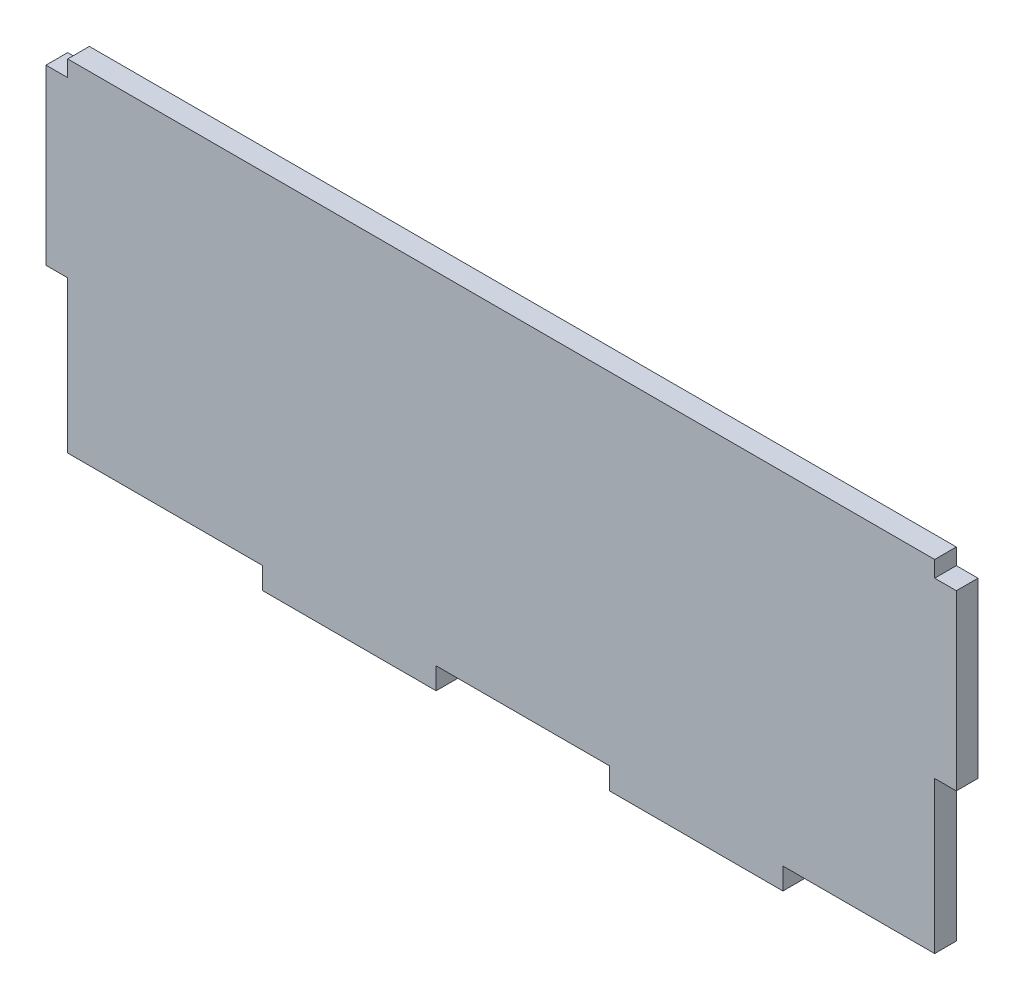
ISO-10303-21;
HEADER;
FILE_DESCRIPTION(('STEP AP214'),'2;1');
FILE_NAME('part.step','',(''),(''),'','','');
FILE_SCHEMA(('AUTOMOTIVE_DESIGN { 1 0 10303 214 1 1 1 1 }'));
ENDSEC;
DATA;
#1=APPLICATION_CONTEXT('core data for automotive mechanical design processes');
#2=APPLICATION_PROTOCOL_DEFINITION('international standard','automotive_design',2000,#1);
#3=PRODUCT_CONTEXT('',#1,'mechanical');
#4=PRODUCT('Part','Part','',(#3));
#5=PRODUCT_RELATED_PRODUCT_CATEGORY('part','',(#4));
#6=PRODUCT_DEFINITION_FORMATION('','',#4);
#7=PRODUCT_DEFINITION_CONTEXT('part definition',#1,'design');
#8=PRODUCT_DEFINITION('design','',#6,#7);
#9=PRODUCT_DEFINITION_SHAPE('','',#8);
#10=(LENGTH_UNIT() NAMED_UNIT(*) SI_UNIT(.MILLI.,.METRE.));
#11=(NAMED_UNIT(*) PLANE_ANGLE_UNIT() SI_UNIT($,.RADIAN.));
#12=(NAMED_UNIT(*) SI_UNIT($,.STERADIAN.) SOLID_ANGLE_UNIT());
#13=UNCERTAINTY_MEASURE_WITH_UNIT(LENGTH_MEASURE(1.E-05),#10,'distance_accuracy_value','');
#14=(GEOMETRIC_REPRESENTATION_CONTEXT(3) GLOBAL_UNCERTAINTY_ASSIGNED_CONTEXT((#13)) GLOBAL_UNIT_ASSIGNED_CONTEXT((#10,
#11,#12)) REPRESENTATION_CONTEXT('',''));
#15=CARTESIAN_POINT('',(0.,0.,0.));
#16=DIRECTION('',(0.,0.,1.));
#17=DIRECTION('',(1.,0.,0.));
#18=AXIS2_PLACEMENT_3D('',#15,#16,#17);
#19=CARTESIAN_POINT('',(57.15,0.,6.35));
#20=DIRECTION('',(0.,1.,0.));
#21=DIRECTION('',(0.,0.,1.));
#22=AXIS2_PLACEMENT_3D('',#19,#20,#21);
#23=PLANE('',#22);
#24=DIRECTION('',(1.,0.,0.));
#25=VECTOR('',#24,1.);
#26=CARTESIAN_POINT('',(57.15,0.,0.));
#27=LINE('',#26,#25);
#28=CARTESIAN_POINT('',(0.,0.,0.));
#29=VERTEX_POINT('',#28);
#30=CARTESIAN_POINT('',(57.15,0.,0.));
#31=VERTEX_POINT('',#30);
#32=EDGE_CURVE('E201',#29,#31,#27,.T.);
#33=ORIENTED_EDGE('',*,*,#32,.T.);
#34=DIRECTION('',(0.,0.,-1.));
#35=VECTOR('',#34,1.);
#36=CARTESIAN_POINT('',(57.15,0.,6.35));
#37=LINE('',#36,#35);
#38=CARTESIAN_POINT('',(57.15,0.,6.35));
#39=VERTEX_POINT('',#38);
#40=EDGE_CURVE('E11',#39,#31,#37,.T.);
#41=ORIENTED_EDGE('',*,*,#40,.F.);
#42=DIRECTION('',(1.,0.,0.));
#43=VECTOR('',#42,1.);
#44=CARTESIAN_POINT('',(57.15,0.,6.35));
#45=LINE('',#44,#43);
#46=CARTESIAN_POINT('',(0.,0.,6.35));
#47=VERTEX_POINT('',#46);
#48=EDGE_CURVE('E239',#47,#39,#45,.T.);
#49=ORIENTED_EDGE('',*,*,#48,.F.);
#50=DIRECTION('',(0.,0.,-1.));
#51=VECTOR('',#50,1.);
#52=CARTESIAN_POINT('',(0.,0.,6.35));
#53=LINE('',#52,#51);
#54=EDGE_CURVE('E197',#47,#29,#53,.T.);
#55=ORIENTED_EDGE('',*,*,#54,.T.);
#56=EDGE_LOOP('',(#33,#41,#49,#55));
#57=FACE_BOUND('',#56,.T.);
#58=ADVANCED_FACE('F33',(#57),#23,.F.);
#59=CARTESIAN_POINT('',(57.15,-6.35,6.35));
#60=DIRECTION('',(1.,0.,0.));
#61=DIRECTION('',(0.,0.,-1.));
#62=AXIS2_PLACEMENT_3D('',#59,#60,#61);
#63=PLANE('',#62);
#64=DIRECTION('',(0.,-1.,0.));
#65=VECTOR('',#64,1.);
#66=CARTESIAN_POINT('',(57.15,-6.35,0.));
#67=LINE('',#66,#65);
#68=CARTESIAN_POINT('',(57.15,-6.35,0.));
#69=VERTEX_POINT('',#68);
#70=EDGE_CURVE('E204',#31,#69,#67,.T.);
#71=ORIENTED_EDGE('',*,*,#70,.T.);
#72=DIRECTION('',(0.,0.,-1.));
#73=VECTOR('',#72,1.);
#74=CARTESIAN_POINT('',(57.15,-6.35,6.35));
#75=LINE('',#74,#73);
#76=CARTESIAN_POINT('',(57.15,-6.35,6.35));
#77=VERTEX_POINT('',#76);
#78=EDGE_CURVE('E41',#77,#69,#75,.T.);
#79=ORIENTED_EDGE('',*,*,#78,.F.);
#80=DIRECTION('',(0.,-1.,0.));
#81=VECTOR('',#80,1.);
#82=CARTESIAN_POINT('',(57.15,-6.35,6.35));
#83=LINE('',#82,#81);
#84=EDGE_CURVE('E128',#39,#77,#83,.T.);
#85=ORIENTED_EDGE('',*,*,#84,.F.);
#86=ORIENTED_EDGE('',*,*,#40,.T.);
#87=EDGE_LOOP('',(#71,#79,#85,#86));
#88=FACE_BOUND('',#87,.T.);
#89=ADVANCED_FACE('F357',(#88),#63,.F.);
#90=CARTESIAN_POINT('',(107.95,-6.35,6.35));
#91=DIRECTION('',(0.,1.,0.));
#92=DIRECTION('',(-1.,0.,0.));
#93=AXIS2_PLACEMENT_3D('',#90,#91,#92);
#94=PLANE('',#93);
#95=DIRECTION('',(1.,0.,0.));
#96=VECTOR('',#95,1.);
#97=CARTESIAN_POINT('',(107.95,-6.35,0.));
#98=LINE('',#97,#96);
#99=CARTESIAN_POINT('',(107.95,-6.35,0.));
#100=VERTEX_POINT('',#99);
#101=EDGE_CURVE('E206',#69,#100,#98,.T.);
#102=ORIENTED_EDGE('',*,*,#101,.T.);
#103=DIRECTION('',(0.,0.,-1.));
#104=VECTOR('',#103,1.);
#105=CARTESIAN_POINT('',(107.95,-6.35,6.35));
#106=LINE('',#105,#104);
#107=CARTESIAN_POINT('',(107.95,-6.35,6.35));
#108=VERTEX_POINT('',#107);
#109=EDGE_CURVE('E282',#108,#100,#106,.T.);
#110=ORIENTED_EDGE('',*,*,#109,.F.);
#111=DIRECTION('',(1.,0.,0.));
#112=VECTOR('',#111,1.);
#113=CARTESIAN_POINT('',(107.95,-6.35,6.35));
#114=LINE('',#113,#112);
#115=EDGE_CURVE('E290',#77,#108,#114,.T.);
#116=ORIENTED_EDGE('',*,*,#115,.F.);
#117=ORIENTED_EDGE('',*,*,#78,.T.);
#118=EDGE_LOOP('',(#102,#110,#116,#117));
#119=FACE_BOUND('',#118,.T.);
#120=ADVANCED_FACE('F288',(#119),#94,.F.);
#121=CARTESIAN_POINT('',(107.95,0.,6.35));
#122=DIRECTION('',(-1.,0.,0.));
#123=DIRECTION('',(0.,0.,1.));
#124=AXIS2_PLACEMENT_3D('',#121,#122,#123);
#125=PLANE('',#124);
#126=DIRECTION('',(0.,1.,0.));
#127=VECTOR('',#126,1.);
#128=CARTESIAN_POINT('',(107.95,0.,0.));
#129=LINE('',#128,#127);
#130=CARTESIAN_POINT('',(107.95,0.,0.));
#131=VERTEX_POINT('',#130);
#132=EDGE_CURVE('E208',#100,#131,#129,.T.);
#133=ORIENTED_EDGE('',*,*,#132,.T.);
#134=DIRECTION('',(0.,0.,-1.));
#135=VECTOR('',#134,1.);
#136=CARTESIAN_POINT('',(107.95,0.,6.35));
#137=LINE('',#136,#135);
#138=CARTESIAN_POINT('',(107.95,0.,6.35));
#139=VERTEX_POINT('',#138);
#140=EDGE_CURVE('E279',#139,#131,#137,.T.);
#141=ORIENTED_EDGE('',*,*,#140,.F.);
#142=DIRECTION('',(0.,1.,0.));
#143=VECTOR('',#142,1.);
#144=CARTESIAN_POINT('',(107.95,0.,6.35));
#145=LINE('',#144,#143);
#146=EDGE_CURVE('E308',#108,#139,#145,.T.);
#147=ORIENTED_EDGE('',*,*,#146,.F.);
#148=ORIENTED_EDGE('',*,*,#109,.T.);
#149=EDGE_LOOP('',(#133,#141,#147,#148));
#150=FACE_BOUND('',#149,.T.);
#151=ADVANCED_FACE('F299',(#150),#125,.F.);
#152=CARTESIAN_POINT('',(158.75,0.,6.35));
#153=DIRECTION('',(0.,1.,0.));
#154=DIRECTION('',(0.,0.,1.));
#155=AXIS2_PLACEMENT_3D('',#152,#153,#154);
#156=PLANE('',#155);
#157=DIRECTION('',(1.,0.,0.));
#158=VECTOR('',#157,1.);
#159=CARTESIAN_POINT('',(158.75,0.,0.));
#160=LINE('',#159,#158);
#161=CARTESIAN_POINT('',(158.75,0.,0.));
#162=VERTEX_POINT('',#161);
#163=EDGE_CURVE('E210',#131,#162,#160,.T.);
#164=ORIENTED_EDGE('',*,*,#163,.T.);
#165=DIRECTION('',(0.,0.,-1.));
#166=VECTOR('',#165,1.);
#167=CARTESIAN_POINT('',(158.75,0.,6.35));
#168=LINE('',#167,#166);
#169=CARTESIAN_POINT('',(158.75,0.,6.35));
#170=VERTEX_POINT('',#169);
#171=EDGE_CURVE('E276',#170,#162,#168,.T.);
#172=ORIENTED_EDGE('',*,*,#171,.F.);
#173=DIRECTION('',(1.,0.,0.));
#174=VECTOR('',#173,1.);
#175=CARTESIAN_POINT('',(158.75,0.,6.35));
#176=LINE('',#175,#174);
#177=EDGE_CURVE('E305',#139,#170,#176,.T.);
#178=ORIENTED_EDGE('',*,*,#177,.F.);
#179=ORIENTED_EDGE('',*,*,#140,.T.);
#180=EDGE_LOOP('',(#164,#172,#178,#179));
#181=FACE_BOUND('',#180,.T.);
#182=ADVANCED_FACE('F303',(#181),#156,.F.);
#183=CARTESIAN_POINT('',(158.75,-6.35,6.35));
#184=DIRECTION('',(1.,0.,0.));
#185=DIRECTION('',(0.,0.,-1.));
#186=AXIS2_PLACEMENT_3D('',#183,#184,#185);
#187=PLANE('',#186);
#188=DIRECTION('',(0.,-1.,0.));
#189=VECTOR('',#188,1.);
#190=CARTESIAN_POINT('',(158.75,-6.35,0.));
#191=LINE('',#190,#189);
#192=CARTESIAN_POINT('',(158.75,-6.35,0.));
#193=VERTEX_POINT('',#192);
#194=EDGE_CURVE('E212',#162,#193,#191,.T.);
#195=ORIENTED_EDGE('',*,*,#194,.T.);
#196=DIRECTION('',(0.,0.,-1.));
#197=VECTOR('',#196,1.);
#198=CARTESIAN_POINT('',(158.75,-6.35,6.35));
#199=LINE('',#198,#197);
#200=CARTESIAN_POINT('',(158.75,-6.35,6.35));
#201=VERTEX_POINT('',#200);
#202=EDGE_CURVE('E273',#201,#193,#199,.T.);
#203=ORIENTED_EDGE('',*,*,#202,.F.);
#204=DIRECTION('',(0.,-1.,0.));
#205=VECTOR('',#204,1.);
#206=CARTESIAN_POINT('',(158.75,-6.35,6.35));
#207=LINE('',#206,#205);
#208=EDGE_CURVE('E307',#170,#201,#207,.T.);
#209=ORIENTED_EDGE('',*,*,#208,.F.);
#210=ORIENTED_EDGE('',*,*,#171,.T.);
#211=EDGE_LOOP('',(#195,#203,#209,#210));
#212=FACE_BOUND('',#211,.T.);
#213=ADVANCED_FACE('F370',(#212),#187,.F.);
#214=CARTESIAN_POINT('',(209.55,-6.35,6.35));
#215=DIRECTION('',(0.,1.,0.));
#216=DIRECTION('',(0.,0.,1.));
#217=AXIS2_PLACEMENT_3D('',#214,#215,#216);
#218=PLANE('',#217);
#219=DIRECTION('',(1.,0.,0.));
#220=VECTOR('',#219,1.);
#221=CARTESIAN_POINT('',(209.55,-6.35,0.));
#222=LINE('',#221,#220);
#223=CARTESIAN_POINT('',(209.55,-6.35,0.));
#224=VERTEX_POINT('',#223);
#225=EDGE_CURVE('E214',#193,#224,#222,.T.);
#226=ORIENTED_EDGE('',*,*,#225,.T.);
#227=DIRECTION('',(0.,0.,-1.));
#228=VECTOR('',#227,1.);
#229=CARTESIAN_POINT('',(209.55,-6.35,6.35));
#230=LINE('',#229,#228);
#231=CARTESIAN_POINT('',(209.55,-6.35,6.35));
#232=VERTEX_POINT('',#231);
#233=EDGE_CURVE('E270',#232,#224,#230,.T.);
#234=ORIENTED_EDGE('',*,*,#233,.F.);
#235=DIRECTION('',(1.,0.,0.));
#236=VECTOR('',#235,1.);
#237=CARTESIAN_POINT('',(209.55,-6.35,6.35));
#238=LINE('',#237,#236);
#239=EDGE_CURVE('E310',#201,#232,#238,.T.);
#240=ORIENTED_EDGE('',*,*,#239,.F.);
#241=ORIENTED_EDGE('',*,*,#202,.T.);
#242=EDGE_LOOP('',(#226,#234,#240,#241));
#243=FACE_BOUND('',#242,.T.);
#244=ADVANCED_FACE('F373',(#243),#218,.F.);
#245=CARTESIAN_POINT('',(209.55,0.,6.35));
#246=DIRECTION('',(-1.,0.,0.));
#247=DIRECTION('',(0.,0.,1.));
#248=AXIS2_PLACEMENT_3D('',#245,#246,#247);
#249=PLANE('',#248);
#250=DIRECTION('',(0.,1.,0.));
#251=VECTOR('',#250,1.);
#252=CARTESIAN_POINT('',(209.55,0.,0.));
#253=LINE('',#252,#251);
#254=CARTESIAN_POINT('',(209.55,0.,0.));
#255=VERTEX_POINT('',#254);
#256=EDGE_CURVE('E216',#224,#255,#253,.T.);
#257=ORIENTED_EDGE('',*,*,#256,.T.);
#258=DIRECTION('',(0.,0.,-1.));
#259=VECTOR('',#258,1.);
#260=CARTESIAN_POINT('',(209.55,0.,6.35));
#261=LINE('',#260,#259);
#262=CARTESIAN_POINT('',(209.55,0.,6.35));
#263=VERTEX_POINT('',#262);
#264=EDGE_CURVE('E267',#263,#255,#261,.T.);
#265=ORIENTED_EDGE('',*,*,#264,.F.);
#266=DIRECTION('',(0.,1.,0.));
#267=VECTOR('',#266,1.);
#268=CARTESIAN_POINT('',(209.55,0.,6.35));
#269=LINE('',#268,#267);
#270=EDGE_CURVE('E316',#232,#263,#269,.T.);
#271=ORIENTED_EDGE('',*,*,#270,.F.);
#272=ORIENTED_EDGE('',*,*,#233,.T.);
#273=EDGE_LOOP('',(#257,#265,#271,#272));
#274=FACE_BOUND('',#273,.T.);
#275=ADVANCED_FACE('F377',(#274),#249,.F.);
#276=CARTESIAN_POINT('',(254.,0.,6.35));
#277=DIRECTION('',(0.,1.,0.));
#278=DIRECTION('',(-1.,0.,0.));
#279=AXIS2_PLACEMENT_3D('',#276,#277,#278);
#280=PLANE('',#279);
#281=DIRECTION('',(1.,0.,0.));
#282=VECTOR('',#281,1.);
#283=CARTESIAN_POINT('',(254.,0.,0.));
#284=LINE('',#283,#282);
#285=CARTESIAN_POINT('',(254.,0.,0.));
#286=VERTEX_POINT('',#285);
#287=EDGE_CURVE('E218',#255,#286,#284,.T.);
#288=ORIENTED_EDGE('',*,*,#287,.T.);
#289=DIRECTION('',(0.,0.,-1.));
#290=VECTOR('',#289,1.);
#291=CARTESIAN_POINT('',(254.,0.,6.35));
#292=LINE('',#291,#290);
#293=CARTESIAN_POINT('',(254.,0.,6.35));
#294=VERTEX_POINT('',#293);
#295=EDGE_CURVE('E264',#294,#286,#292,.T.);
#296=ORIENTED_EDGE('',*,*,#295,.F.);
#297=DIRECTION('',(1.,0.,0.));
#298=VECTOR('',#297,1.);
#299=CARTESIAN_POINT('',(254.,0.,6.35));
#300=LINE('',#299,#298);
#301=EDGE_CURVE('E318',#263,#294,#300,.T.);
#302=ORIENTED_EDGE('',*,*,#301,.F.);
#303=ORIENTED_EDGE('',*,*,#264,.T.);
#304=EDGE_LOOP('',(#288,#296,#302,#303));
#305=FACE_BOUND('',#304,.T.);
#306=ADVANCED_FACE('F381',(#305),#280,.F.);
#307=CARTESIAN_POINT('',(254.,0.,6.35));
#308=DIRECTION('',(-1.,0.,0.));
#309=DIRECTION('',(0.,0.,1.));
#310=AXIS2_PLACEMENT_3D('',#307,#308,#309);
#311=PLANE('',#310);
#312=DIRECTION('',(0.,1.,0.));
#313=VECTOR('',#312,1.);
#314=CARTESIAN_POINT('',(254.,0.,0.));
#315=LINE('',#314,#313);
#316=CARTESIAN_POINT('',(254.,44.45,0.));
#317=VERTEX_POINT('',#316);
#318=EDGE_CURVE('E220',#286,#317,#315,.T.);
#319=ORIENTED_EDGE('',*,*,#318,.T.);
#320=DIRECTION('',(0.,0.,-1.));
#321=VECTOR('',#320,1.);
#322=CARTESIAN_POINT('',(254.,44.45,6.35));
#323=LINE('',#322,#321);
#324=CARTESIAN_POINT('',(254.,44.45,6.35));
#325=VERTEX_POINT('',#324);
#326=EDGE_CURVE('E261',#325,#317,#323,.T.);
#327=ORIENTED_EDGE('',*,*,#326,.F.);
#328=DIRECTION('',(0.,1.,0.));
#329=VECTOR('',#328,1.);
#330=CARTESIAN_POINT('',(254.,0.,6.35));
#331=LINE('',#330,#329);
#332=EDGE_CURVE('E320',#294,#325,#331,.T.);
#333=ORIENTED_EDGE('',*,*,#332,.F.);
#334=ORIENTED_EDGE('',*,*,#295,.T.);
#335=EDGE_LOOP('',(#319,#327,#333,#334));
#336=FACE_BOUND('',#335,.T.);
#337=ADVANCED_FACE('F385',(#336),#311,.F.);
#338=CARTESIAN_POINT('',(254.,44.45,6.35));
#339=DIRECTION('',(0.,1.,0.));
#340=DIRECTION('',(0.,0.,1.));
#341=AXIS2_PLACEMENT_3D('',#338,#339,#340);
#342=PLANE('',#341);
#343=DIRECTION('',(1.,0.,0.));
#344=VECTOR('',#343,1.);
#345=CARTESIAN_POINT('',(254.,44.45,0.));
#346=LINE('',#345,#344);
#347=CARTESIAN_POINT('',(260.35,44.45,0.));
#348=VERTEX_POINT('',#347);
#349=EDGE_CURVE('E222',#317,#348,#346,.T.);
#350=ORIENTED_EDGE('',*,*,#349,.T.);
#351=DIRECTION('',(0.,0.,-1.));
#352=VECTOR('',#351,1.);
#353=CARTESIAN_POINT('',(260.35,44.45,6.35));
#354=LINE('',#353,#352);
#355=CARTESIAN_POINT('',(260.35,44.45,6.35));
#356=VERTEX_POINT('',#355);
#357=EDGE_CURVE('E258',#356,#348,#354,.T.);
#358=ORIENTED_EDGE('',*,*,#357,.F.);
#359=DIRECTION('',(1.,0.,0.));
#360=VECTOR('',#359,1.);
#361=CARTESIAN_POINT('',(254.,44.45,6.35));
#362=LINE('',#361,#360);
#363=EDGE_CURVE('E322',#325,#356,#362,.T.);
#364=ORIENTED_EDGE('',*,*,#363,.F.);
#365=ORIENTED_EDGE('',*,*,#326,.T.);
#366=EDGE_LOOP('',(#350,#358,#364,#365));
#367=FACE_BOUND('',#366,.T.);
#368=ADVANCED_FACE('F389',(#367),#342,.F.);
#369=CARTESIAN_POINT('',(260.35,44.45,6.35));
#370=DIRECTION('',(-1.,0.,0.));
#371=DIRECTION('',(0.,0.,1.));
#372=AXIS2_PLACEMENT_3D('',#369,#370,#371);
#373=PLANE('',#372);
#374=DIRECTION('',(0.,1.,0.));
#375=VECTOR('',#374,1.);
#376=CARTESIAN_POINT('',(260.35,44.45,0.));
#377=LINE('',#376,#375);
#378=CARTESIAN_POINT('',(260.35,95.25,0.));
#379=VERTEX_POINT('',#378);
#380=EDGE_CURVE('E224',#348,#379,#377,.T.);
#381=ORIENTED_EDGE('',*,*,#380,.T.);
#382=DIRECTION('',(0.,0.,-1.));
#383=VECTOR('',#382,1.);
#384=CARTESIAN_POINT('',(260.35,95.25,6.35));
#385=LINE('',#384,#383);
#386=CARTESIAN_POINT('',(260.35,95.25,6.35));
#387=VERTEX_POINT('',#386);
#388=EDGE_CURVE('E255',#387,#379,#385,.T.);
#389=ORIENTED_EDGE('',*,*,#388,.F.);
#390=DIRECTION('',(0.,1.,0.));
#391=VECTOR('',#390,1.);
#392=CARTESIAN_POINT('',(260.35,44.45,6.35));
#393=LINE('',#392,#391);
#394=EDGE_CURVE('E324',#356,#387,#393,.T.);
#395=ORIENTED_EDGE('',*,*,#394,.F.);
#396=ORIENTED_EDGE('',*,*,#357,.T.);
#397=EDGE_LOOP('',(#381,#389,#395,#396));
#398=FACE_BOUND('',#397,.T.);
#399=ADVANCED_FACE('F393',(#398),#373,.F.);
#400=CARTESIAN_POINT('',(260.35,95.25,6.35));
#401=DIRECTION('',(0.,-1.,0.));
#402=DIRECTION('',(0.,0.,-1.));
#403=AXIS2_PLACEMENT_3D('',#400,#401,#402);
#404=PLANE('',#403);
#405=DIRECTION('',(-1.,0.,0.));
#406=VECTOR('',#405,1.);
#407=CARTESIAN_POINT('',(260.35,95.25,0.));
#408=LINE('',#407,#406);
#409=CARTESIAN_POINT('',(254.,95.25,0.));
#410=VERTEX_POINT('',#409);
#411=EDGE_CURVE('E226',#379,#410,#408,.T.);
#412=ORIENTED_EDGE('',*,*,#411,.T.);
#413=DIRECTION('',(0.,0.,-1.));
#414=VECTOR('',#413,1.);
#415=CARTESIAN_POINT('',(254.,95.25,6.35));
#416=LINE('',#415,#414);
#417=CARTESIAN_POINT('',(254.,95.25,6.35));
#418=VERTEX_POINT('',#417);
#419=EDGE_CURVE('E252',#418,#410,#416,.T.);
#420=ORIENTED_EDGE('',*,*,#419,.F.);
#421=DIRECTION('',(-1.,0.,0.));
#422=VECTOR('',#421,1.);
#423=CARTESIAN_POINT('',(260.35,95.25,6.35));
#424=LINE('',#423,#422);
#425=EDGE_CURVE('E326',#387,#418,#424,.T.);
#426=ORIENTED_EDGE('',*,*,#425,.F.);
#427=ORIENTED_EDGE('',*,*,#388,.T.);
#428=EDGE_LOOP('',(#412,#420,#426,#427));
#429=FACE_BOUND('',#428,.T.);
#430=ADVANCED_FACE('F397',(#429),#404,.F.);
#431=CARTESIAN_POINT('',(254.,95.25,6.35));
#432=DIRECTION('',(-1.,0.,0.));
#433=DIRECTION('',(0.,0.,1.));
#434=AXIS2_PLACEMENT_3D('',#431,#432,#433);
#435=PLANE('',#434);
#436=DIRECTION('',(0.,1.,0.));
#437=VECTOR('',#436,1.);
#438=CARTESIAN_POINT('',(254.,95.25,0.));
#439=LINE('',#438,#437);
#440=CARTESIAN_POINT('',(254.,100.,0.));
#441=VERTEX_POINT('',#440);
#442=EDGE_CURVE('E228',#410,#441,#439,.T.);
#443=ORIENTED_EDGE('',*,*,#442,.T.);
#444=DIRECTION('',(0.,0.,-1.));
#445=VECTOR('',#444,1.);
#446=CARTESIAN_POINT('',(254.,100.,6.35));
#447=LINE('',#446,#445);
#448=CARTESIAN_POINT('',(254.,100.,6.35));
#449=VERTEX_POINT('',#448);
#450=EDGE_CURVE('E249',#449,#441,#447,.T.);
#451=ORIENTED_EDGE('',*,*,#450,.F.);
#452=DIRECTION('',(0.,1.,0.));
#453=VECTOR('',#452,1.);
#454=CARTESIAN_POINT('',(254.,95.25,6.35));
#455=LINE('',#454,#453);
#456=EDGE_CURVE('E328',#418,#449,#455,.T.);
#457=ORIENTED_EDGE('',*,*,#456,.F.);
#458=ORIENTED_EDGE('',*,*,#419,.T.);
#459=EDGE_LOOP('',(#443,#451,#457,#458));
#460=FACE_BOUND('',#459,.T.);
#461=ADVANCED_FACE('F401',(#460),#435,.F.);
#462=CARTESIAN_POINT('',(0.,100.,6.35));
#463=DIRECTION('',(0.,-1.,0.));
#464=DIRECTION('',(0.,0.,-1.));
#465=AXIS2_PLACEMENT_3D('',#462,#463,#464);
#466=PLANE('',#465);
#467=DIRECTION('',(-1.,0.,0.));
#468=VECTOR('',#467,1.);
#469=CARTESIAN_POINT('',(0.,100.,0.));
#470=LINE('',#469,#468);
#471=CARTESIAN_POINT('',(0.,100.,0.));
#472=VERTEX_POINT('',#471);
#473=EDGE_CURVE('E230',#441,#472,#470,.T.);
#474=ORIENTED_EDGE('',*,*,#473,.T.);
#475=DIRECTION('',(0.,0.,-1.));
#476=VECTOR('',#475,1.);
#477=CARTESIAN_POINT('',(0.,100.,6.35));
#478=LINE('',#477,#476);
#479=CARTESIAN_POINT('',(0.,100.,6.35));
#480=VERTEX_POINT('',#479);
#481=EDGE_CURVE('E246',#480,#472,#478,.T.);
#482=ORIENTED_EDGE('',*,*,#481,.F.);
#483=DIRECTION('',(-1.,0.,0.));
#484=VECTOR('',#483,1.);
#485=CARTESIAN_POINT('',(0.,100.,6.35));
#486=LINE('',#485,#484);
#487=EDGE_CURVE('E330',#449,#480,#486,.T.);
#488=ORIENTED_EDGE('',*,*,#487,.F.);
#489=ORIENTED_EDGE('',*,*,#450,.T.);
#490=EDGE_LOOP('',(#474,#482,#488,#489));
#491=FACE_BOUND('',#490,.T.);
#492=ADVANCED_FACE('F405',(#491),#466,.F.);
#493=CARTESIAN_POINT('',(0.,95.25,6.35));
#494=DIRECTION('',(1.,0.,0.));
#495=DIRECTION('',(0.,0.,-1.));
#496=AXIS2_PLACEMENT_3D('',#493,#494,#495);
#497=PLANE('',#496);
#498=DIRECTION('',(0.,-1.,0.));
#499=VECTOR('',#498,1.);
#500=CARTESIAN_POINT('',(0.,95.25,0.));
#501=LINE('',#500,#499);
#502=CARTESIAN_POINT('',(0.,95.25,0.));
#503=VERTEX_POINT('',#502);
#504=EDGE_CURVE('E232',#472,#503,#501,.T.);
#505=ORIENTED_EDGE('',*,*,#504,.T.);
#506=DIRECTION('',(0.,0.,-1.));
#507=VECTOR('',#506,1.);
#508=CARTESIAN_POINT('',(0.,95.25,6.35));
#509=LINE('',#508,#507);
#510=CARTESIAN_POINT('',(0.,95.25,6.35));
#511=VERTEX_POINT('',#510);
#512=EDGE_CURVE('E243',#511,#503,#509,.T.);
#513=ORIENTED_EDGE('',*,*,#512,.F.);
#514=DIRECTION('',(0.,-1.,0.));
#515=VECTOR('',#514,1.);
#516=CARTESIAN_POINT('',(0.,95.25,6.35));
#517=LINE('',#516,#515);
#518=EDGE_CURVE('E332',#480,#511,#517,.T.);
#519=ORIENTED_EDGE('',*,*,#518,.F.);
#520=ORIENTED_EDGE('',*,*,#481,.T.);
#521=EDGE_LOOP('',(#505,#513,#519,#520));
#522=FACE_BOUND('',#521,.T.);
#523=ADVANCED_FACE('F338',(#522),#497,.F.);
#524=CARTESIAN_POINT('',(-6.35,95.25,6.35));
#525=DIRECTION('',(0.,-1.,0.));
#526=DIRECTION('',(0.,0.,-1.));
#527=AXIS2_PLACEMENT_3D('',#524,#525,#526);
#528=PLANE('',#527);
#529=DIRECTION('',(-1.,0.,0.));
#530=VECTOR('',#529,1.);
#531=CARTESIAN_POINT('',(-6.35,95.25,0.));
#532=LINE('',#531,#530);
#533=CARTESIAN_POINT('',(-6.35,95.25,0.));
#534=VERTEX_POINT('',#533);
#535=EDGE_CURVE('E234',#503,#534,#532,.T.);
#536=ORIENTED_EDGE('',*,*,#535,.T.);
#537=DIRECTION('',(0.,0.,-1.));
#538=VECTOR('',#537,1.);
#539=CARTESIAN_POINT('',(-6.35,95.25,6.35));
#540=LINE('',#539,#538);
#541=CARTESIAN_POINT('',(-6.35,95.25,6.35));
#542=VERTEX_POINT('',#541);
#543=EDGE_CURVE('E192',#542,#534,#540,.T.);
#544=ORIENTED_EDGE('',*,*,#543,.F.);
#545=DIRECTION('',(-1.,0.,0.));
#546=VECTOR('',#545,1.);
#547=CARTESIAN_POINT('',(-6.35,95.25,6.35));
#548=LINE('',#547,#546);
#549=EDGE_CURVE('E183',#511,#542,#548,.T.);
#550=ORIENTED_EDGE('',*,*,#549,.F.);
#551=ORIENTED_EDGE('',*,*,#512,.T.);
#552=EDGE_LOOP('',(#536,#544,#550,#551));
#553=FACE_BOUND('',#552,.T.);
#554=ADVANCED_FACE('F342',(#553),#528,.F.);
#555=CARTESIAN_POINT('',(-6.35,44.45,6.35));
#556=DIRECTION('',(1.,0.,0.));
#557=DIRECTION('',(0.,0.,-1.));
#558=AXIS2_PLACEMENT_3D('',#555,#556,#557);
#559=PLANE('',#558);
#560=DIRECTION('',(0.,-1.,0.));
#561=VECTOR('',#560,1.);
#562=CARTESIAN_POINT('',(-6.35,44.45,0.));
#563=LINE('',#562,#561);
#564=CARTESIAN_POINT('',(-6.35,44.45,0.));
#565=VERTEX_POINT('',#564);
#566=EDGE_CURVE('E191',#534,#565,#563,.T.);
#567=ORIENTED_EDGE('',*,*,#566,.T.);
#568=DIRECTION('',(0.,0.,-1.));
#569=VECTOR('',#568,1.);
#570=CARTESIAN_POINT('',(-6.35,44.45,6.35));
#571=LINE('',#570,#569);
#572=CARTESIAN_POINT('',(-6.35,44.45,6.35));
#573=VERTEX_POINT('',#572);
#574=EDGE_CURVE('E188',#573,#565,#571,.T.);
#575=ORIENTED_EDGE('',*,*,#574,.F.);
#576=DIRECTION('',(0.,-1.,0.));
#577=VECTOR('',#576,1.);
#578=CARTESIAN_POINT('',(-6.35,44.45,6.35));
#579=LINE('',#578,#577);
#580=EDGE_CURVE('E177',#542,#573,#579,.T.);
#581=ORIENTED_EDGE('',*,*,#580,.F.);
#582=ORIENTED_EDGE('',*,*,#543,.T.);
#583=EDGE_LOOP('',(#567,#575,#581,#582));
#584=FACE_BOUND('',#583,.T.);
#585=ADVANCED_FACE('F189',(#584),#559,.F.);
#586=CARTESIAN_POINT('',(0.,44.45,6.35));
#587=DIRECTION('',(0.,1.,0.));
#588=DIRECTION('',(0.,0.,1.));
#589=AXIS2_PLACEMENT_3D('',#586,#587,#588);
#590=PLANE('',#589);
#591=DIRECTION('',(1.,0.,0.));
#592=VECTOR('',#591,1.);
#593=CARTESIAN_POINT('',(0.,44.45,0.));
#594=LINE('',#593,#592);
#595=CARTESIAN_POINT('',(0.,44.45,0.));
#596=VERTEX_POINT('',#595);
#597=EDGE_CURVE('E114',#565,#596,#594,.T.);
#598=ORIENTED_EDGE('',*,*,#597,.T.);
#599=DIRECTION('',(0.,0.,-1.));
#600=VECTOR('',#599,1.);
#601=CARTESIAN_POINT('',(0.,44.45,6.35));
#602=LINE('',#601,#600);
#603=CARTESIAN_POINT('',(0.,44.45,6.35));
#604=VERTEX_POINT('',#603);
#605=EDGE_CURVE('E193',#604,#596,#602,.T.);
#606=ORIENTED_EDGE('',*,*,#605,.F.);
#607=DIRECTION('',(1.,0.,0.));
#608=VECTOR('',#607,1.);
#609=CARTESIAN_POINT('',(0.,44.45,6.35));
#610=LINE('',#609,#608);
#611=EDGE_CURVE('E181',#573,#604,#610,.T.);
#612=ORIENTED_EDGE('',*,*,#611,.F.);
#613=ORIENTED_EDGE('',*,*,#574,.T.);
#614=EDGE_LOOP('',(#598,#606,#612,#613));
#615=FACE_BOUND('',#614,.T.);
#616=ADVANCED_FACE('F195',(#615),#590,.F.);
#617=CARTESIAN_POINT('',(0.,0.,6.35));
#618=DIRECTION('',(1.,0.,0.));
#619=DIRECTION('',(0.,0.,-1.));
#620=AXIS2_PLACEMENT_3D('',#617,#618,#619);
#621=PLANE('',#620);
#622=DIRECTION('',(0.,-1.,0.));
#623=VECTOR('',#622,1.);
#624=CARTESIAN_POINT('',(0.,0.,0.));
#625=LINE('',#624,#623);
#626=EDGE_CURVE('E120',#596,#29,#625,.T.);
#627=ORIENTED_EDGE('',*,*,#626,.T.);
#628=ORIENTED_EDGE('',*,*,#54,.F.);
#629=DIRECTION('',(0.,-1.,0.));
#630=VECTOR('',#629,1.);
#631=CARTESIAN_POINT('',(0.,0.,6.35));
#632=LINE('',#631,#630);
#633=EDGE_CURVE('E49',#604,#47,#632,.T.);
#634=ORIENTED_EDGE('',*,*,#633,.F.);
#635=ORIENTED_EDGE('',*,*,#605,.T.);
#636=EDGE_LOOP('',(#627,#628,#634,#635));
#637=FACE_BOUND('',#636,.T.);
#638=ADVANCED_FACE('F346',(#637),#621,.F.);
#639=CARTESIAN_POINT('',(0.,0.,6.35));
#640=DIRECTION('',(0.,0.,-1.));
#641=DIRECTION('',(-1.,0.,0.));
#642=AXIS2_PLACEMENT_3D('',#639,#640,#641);
#643=PLANE('',#642);
#644=ORIENTED_EDGE('',*,*,#48,.T.);
#645=ORIENTED_EDGE('',*,*,#84,.T.);
#646=ORIENTED_EDGE('',*,*,#115,.T.);
#647=ORIENTED_EDGE('',*,*,#146,.T.);
#648=ORIENTED_EDGE('',*,*,#177,.T.);
#649=ORIENTED_EDGE('',*,*,#208,.T.);
#650=ORIENTED_EDGE('',*,*,#239,.T.);
#651=ORIENTED_EDGE('',*,*,#270,.T.);
#652=ORIENTED_EDGE('',*,*,#301,.T.);
#653=ORIENTED_EDGE('',*,*,#332,.T.);
#654=ORIENTED_EDGE('',*,*,#363,.T.);
#655=ORIENTED_EDGE('',*,*,#394,.T.);
#656=ORIENTED_EDGE('',*,*,#425,.T.);
#657=ORIENTED_EDGE('',*,*,#456,.T.);
#658=ORIENTED_EDGE('',*,*,#487,.T.);
#659=ORIENTED_EDGE('',*,*,#518,.T.);
#660=ORIENTED_EDGE('',*,*,#549,.T.);
#661=ORIENTED_EDGE('',*,*,#580,.T.);
#662=ORIENTED_EDGE('',*,*,#611,.T.);
#663=ORIENTED_EDGE('',*,*,#633,.T.);
#664=EDGE_LOOP('',(#644,#645,#646,#647,#648,#649,#650,#651,#652,#653,#654,#655,#656,#657,#658,
#659,#660,#661,#662,#663));
#665=FACE_BOUND('',#664,.T.);
#666=ADVANCED_FACE('F179',(#665),#643,.F.);
#667=CARTESIAN_POINT('',(0.,0.,0.));
#668=DIRECTION('',(0.,0.,-1.));
#669=DIRECTION('',(-1.,0.,0.));
#670=AXIS2_PLACEMENT_3D('',#667,#668,#669);
#671=PLANE('',#670);
#672=ORIENTED_EDGE('',*,*,#32,.F.);
#673=ORIENTED_EDGE('',*,*,#626,.F.);
#674=ORIENTED_EDGE('',*,*,#597,.F.);
#675=ORIENTED_EDGE('',*,*,#566,.F.);
#676=ORIENTED_EDGE('',*,*,#535,.F.);
#677=ORIENTED_EDGE('',*,*,#504,.F.);
#678=ORIENTED_EDGE('',*,*,#473,.F.);
#679=ORIENTED_EDGE('',*,*,#442,.F.);
#680=ORIENTED_EDGE('',*,*,#411,.F.);
#681=ORIENTED_EDGE('',*,*,#380,.F.);
#682=ORIENTED_EDGE('',*,*,#349,.F.);
#683=ORIENTED_EDGE('',*,*,#318,.F.);
#684=ORIENTED_EDGE('',*,*,#287,.F.);
#685=ORIENTED_EDGE('',*,*,#256,.F.);
#686=ORIENTED_EDGE('',*,*,#225,.F.);
#687=ORIENTED_EDGE('',*,*,#194,.F.);
#688=ORIENTED_EDGE('',*,*,#163,.F.);
#689=ORIENTED_EDGE('',*,*,#132,.F.);
#690=ORIENTED_EDGE('',*,*,#101,.F.);
#691=ORIENTED_EDGE('',*,*,#70,.F.);
#692=EDGE_LOOP('',(#672,#673,#674,#675,#676,#677,#678,#679,#680,#681,#682,#683,#684,#685,#686,
#687,#688,#689,#690,#691));
#693=FACE_BOUND('',#692,.T.);
#694=ADVANCED_FACE('F294',(#693),#671,.T.);
#695=CLOSED_SHELL('',(#58,#89,#120,#151,#182,#213,#244,#275,#306,#337,#368,#399,#430,#461,#492,
#523,#554,#585,#616,#638,#666,#694));
#696=MANIFOLD_SOLID_BREP('B2',#695);
#697=ADVANCED_BREP_SHAPE_REPRESENTATION('',(#18,#696),#14);
#698=SHAPE_DEFINITION_REPRESENTATION(#9,#697);
ENDSEC;
END-ISO-10303-21;
